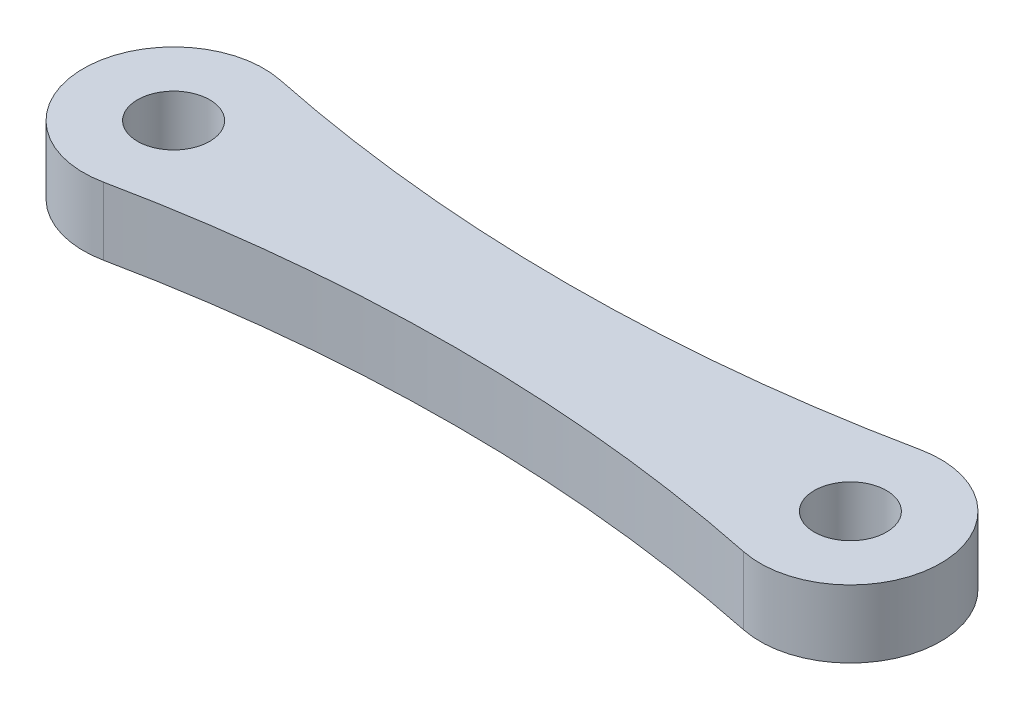
ISO-10303-21;
HEADER;
FILE_DESCRIPTION(('STEP AP214'),'2;1');
FILE_NAME('part.step','',(''),(''),'','','');
FILE_SCHEMA(('AUTOMOTIVE_DESIGN { 1 0 10303 214 1 1 1 1 }'));
ENDSEC;
DATA;
#1=APPLICATION_CONTEXT('core data for automotive mechanical design processes');
#2=APPLICATION_PROTOCOL_DEFINITION('international standard','automotive_design',2000,#1);
#3=PRODUCT_CONTEXT('',#1,'mechanical');
#4=PRODUCT('Part','Part','',(#3));
#5=PRODUCT_RELATED_PRODUCT_CATEGORY('part','',(#4));
#6=PRODUCT_DEFINITION_FORMATION('','',#4);
#7=PRODUCT_DEFINITION_CONTEXT('part definition',#1,'design');
#8=PRODUCT_DEFINITION('design','',#6,#7);
#9=PRODUCT_DEFINITION_SHAPE('','',#8);
#10=(LENGTH_UNIT() NAMED_UNIT(*) SI_UNIT(.MILLI.,.METRE.));
#11=(NAMED_UNIT(*) PLANE_ANGLE_UNIT() SI_UNIT($,.RADIAN.));
#12=(NAMED_UNIT(*) SI_UNIT($,.STERADIAN.) SOLID_ANGLE_UNIT());
#13=UNCERTAINTY_MEASURE_WITH_UNIT(LENGTH_MEASURE(1.E-05),#10,'distance_accuracy_value','');
#14=(GEOMETRIC_REPRESENTATION_CONTEXT(3) GLOBAL_UNCERTAINTY_ASSIGNED_CONTEXT((#13)) GLOBAL_UNIT_ASSIGNED_CONTEXT((#10,
#11,#12)) REPRESENTATION_CONTEXT('',''));
#15=CARTESIAN_POINT('',(0.,0.,0.));
#16=DIRECTION('',(0.,0.,1.));
#17=DIRECTION('',(1.,0.,0.));
#18=AXIS2_PLACEMENT_3D('',#15,#16,#17);
#19=CARTESIAN_POINT('',(-7.5,1.5,0.));
#20=DIRECTION('',(0.,1.,0.));
#21=DIRECTION('',(0.,0.,1.));
#22=AXIS2_PLACEMENT_3D('',#19,#20,#21);
#23=PLANE('',#22);
#24=CARTESIAN_POINT('',(-7.5,1.5,0.));
#25=DIRECTION('',(0.,1.,0.));
#26=DIRECTION('',(0.,0.,1.));
#27=AXIS2_PLACEMENT_3D('',#24,#25,#26);
#28=CIRCLE('',#27,0.800000000000001);
#29=CARTESIAN_POINT('',(-7.5,1.5,0.800000000000001));
#30=VERTEX_POINT('',#29);
#31=EDGE_CURVE('E87',#30,#30,#28,.T.);
#32=ORIENTED_EDGE('',*,*,#31,.F.);
#33=EDGE_LOOP('',(#32));
#34=FACE_BOUND('',#33,.T.);
#35=CARTESIAN_POINT('',(7.5,1.5,0.));
#36=DIRECTION('',(0.,1.,0.));
#37=DIRECTION('',(0.,0.,1.));
#38=AXIS2_PLACEMENT_3D('',#35,#36,#37);
#39=CIRCLE('',#38,0.800000000000001);
#40=CARTESIAN_POINT('',(7.5,1.5,0.799999999999998));
#41=VERTEX_POINT('',#40);
#42=EDGE_CURVE('E120',#41,#41,#39,.T.);
#43=ORIENTED_EDGE('',*,*,#42,.F.);
#44=EDGE_LOOP('',(#43));
#45=FACE_BOUND('',#44,.T.);
#46=CARTESIAN_POINT('',(7.5,1.5,0.));
#47=DIRECTION('',(0.,1.,0.));
#48=DIRECTION('',(0.,0.,1.));
#49=AXIS2_PLACEMENT_3D('',#46,#47,#48);
#50=CIRCLE('',#49,2.);
#51=CARTESIAN_POINT('',(7.09459459459459,1.5,1.95848065021539));
#52=VERTEX_POINT('',#51);
#53=CARTESIAN_POINT('',(7.09459459459459,1.5,-1.95848065021539));
#54=VERTEX_POINT('',#53);
#55=EDGE_CURVE('E12',#52,#54,#50,.T.);
#56=ORIENTED_EDGE('',*,*,#55,.T.);
#57=CARTESIAN_POINT('',(0.,1.5,-36.2318920289846));
#58=DIRECTION('',(0.,-1.,0.));
#59=DIRECTION('',(0.,0.,1.));
#60=AXIS2_PLACEMENT_3D('',#57,#58,#59);
#61=CIRCLE('',#60,35.);
#62=CARTESIAN_POINT('',(-7.09459459459459,1.5,-1.95848065021539));
#63=VERTEX_POINT('',#62);
#64=EDGE_CURVE('E106',#54,#63,#61,.T.);
#65=ORIENTED_EDGE('',*,*,#64,.T.);
#66=CARTESIAN_POINT('',(-7.5,1.5,0.));
#67=DIRECTION('',(0.,1.,0.));
#68=DIRECTION('',(0.,0.,1.));
#69=AXIS2_PLACEMENT_3D('',#66,#67,#68);
#70=CIRCLE('',#69,2.);
#71=CARTESIAN_POINT('',(-7.09459459459459,1.5,1.95848065021539));
#72=VERTEX_POINT('',#71);
#73=EDGE_CURVE('E50',#63,#72,#70,.T.);
#74=ORIENTED_EDGE('',*,*,#73,.T.);
#75=CARTESIAN_POINT('',(0.,1.5,36.2318920289846));
#76=DIRECTION('',(0.,-1.,0.));
#77=DIRECTION('',(0.,0.,-1.));
#78=AXIS2_PLACEMENT_3D('',#75,#76,#77);
#79=CIRCLE('',#78,35.);
#80=EDGE_CURVE('E100',#72,#52,#79,.T.);
#81=ORIENTED_EDGE('',*,*,#80,.T.);
#82=EDGE_LOOP('',(#56,#65,#74,#81));
#83=FACE_BOUND('',#82,.T.);
#84=ADVANCED_FACE('F40',(#34,#45,#83),#23,.T.);
#85=CARTESIAN_POINT('',(-7.5,0.,0.));
#86=DIRECTION('',(0.,1.,0.));
#87=DIRECTION('',(0.,0.,1.));
#88=AXIS2_PLACEMENT_3D('',#85,#86,#87);
#89=PLANE('',#88);
#90=CARTESIAN_POINT('',(-7.5,0.,0.));
#91=DIRECTION('',(0.,1.,0.));
#92=DIRECTION('',(0.,0.,1.));
#93=AXIS2_PLACEMENT_3D('',#90,#91,#92);
#94=CIRCLE('',#93,0.800000000000001);
#95=CARTESIAN_POINT('',(-7.5,0.,0.800000000000001));
#96=VERTEX_POINT('',#95);
#97=EDGE_CURVE('E124',#96,#96,#94,.T.);
#98=ORIENTED_EDGE('',*,*,#97,.T.);
#99=EDGE_LOOP('',(#98));
#100=FACE_BOUND('',#99,.T.);
#101=CARTESIAN_POINT('',(7.5,0.,0.));
#102=DIRECTION('',(0.,1.,0.));
#103=DIRECTION('',(0.,0.,1.));
#104=AXIS2_PLACEMENT_3D('',#101,#102,#103);
#105=CIRCLE('',#104,0.800000000000001);
#106=CARTESIAN_POINT('',(7.5,0.,0.799999999999998));
#107=VERTEX_POINT('',#106);
#108=EDGE_CURVE('E113',#107,#107,#105,.T.);
#109=ORIENTED_EDGE('',*,*,#108,.T.);
#110=EDGE_LOOP('',(#109));
#111=FACE_BOUND('',#110,.T.);
#112=CARTESIAN_POINT('',(0.,0.,-36.2318920289846));
#113=DIRECTION('',(0.,-1.,0.));
#114=DIRECTION('',(0.,0.,1.));
#115=AXIS2_PLACEMENT_3D('',#112,#113,#114);
#116=CIRCLE('',#115,35.);
#117=CARTESIAN_POINT('',(7.09459459459459,0.,-1.95848065021539));
#118=VERTEX_POINT('',#117);
#119=CARTESIAN_POINT('',(-7.09459459459459,0.,-1.95848065021539));
#120=VERTEX_POINT('',#119);
#121=EDGE_CURVE('E83',#118,#120,#116,.T.);
#122=ORIENTED_EDGE('',*,*,#121,.F.);
#123=CARTESIAN_POINT('',(7.5,0.,0.));
#124=DIRECTION('',(0.,1.,0.));
#125=DIRECTION('',(0.,0.,1.));
#126=AXIS2_PLACEMENT_3D('',#123,#124,#125);
#127=CIRCLE('',#126,2.);
#128=CARTESIAN_POINT('',(7.09459459459459,0.,1.95848065021539));
#129=VERTEX_POINT('',#128);
#130=EDGE_CURVE('E44',#129,#118,#127,.T.);
#131=ORIENTED_EDGE('',*,*,#130,.F.);
#132=CARTESIAN_POINT('',(0.,0.,36.2318920289846));
#133=DIRECTION('',(0.,-1.,0.));
#134=DIRECTION('',(0.,0.,-1.));
#135=AXIS2_PLACEMENT_3D('',#132,#133,#134);
#136=CIRCLE('',#135,35.);
#137=CARTESIAN_POINT('',(-7.09459459459459,0.,1.95848065021539));
#138=VERTEX_POINT('',#137);
#139=EDGE_CURVE('E85',#138,#129,#136,.T.);
#140=ORIENTED_EDGE('',*,*,#139,.F.);
#141=CARTESIAN_POINT('',(-7.5,0.,0.));
#142=DIRECTION('',(0.,1.,0.));
#143=DIRECTION('',(0.,0.,1.));
#144=AXIS2_PLACEMENT_3D('',#141,#142,#143);
#145=CIRCLE('',#144,2.);
#146=EDGE_CURVE('E58',#120,#138,#145,.T.);
#147=ORIENTED_EDGE('',*,*,#146,.F.);
#148=EDGE_LOOP('',(#122,#131,#140,#147));
#149=FACE_BOUND('',#148,.T.);
#150=ADVANCED_FACE('F81',(#100,#111,#149),#89,.F.);
#151=CARTESIAN_POINT('',(-7.5,1.5,0.));
#152=DIRECTION('',(0.,-1.,0.));
#153=DIRECTION('',(0.,0.,-1.));
#154=AXIS2_PLACEMENT_3D('',#151,#152,#153);
#155=CYLINDRICAL_SURFACE('',#154,2.);
#156=ORIENTED_EDGE('',*,*,#146,.T.);
#157=DIRECTION('',(0.,1.,0.));
#158=VECTOR('',#157,1.);
#159=CARTESIAN_POINT('',(-7.09459459459459,0.,1.95848065021539));
#160=LINE('',#159,#158);
#161=EDGE_CURVE('E93',#138,#72,#160,.T.);
#162=ORIENTED_EDGE('',*,*,#161,.T.);
#163=ORIENTED_EDGE('',*,*,#73,.F.);
#164=DIRECTION('',(0.,1.,0.));
#165=VECTOR('',#164,1.);
#166=CARTESIAN_POINT('',(-7.09459459459459,0.,-1.95848065021539));
#167=LINE('',#166,#165);
#168=EDGE_CURVE('E88',#120,#63,#167,.T.);
#169=ORIENTED_EDGE('',*,*,#168,.F.);
#170=EDGE_LOOP('',(#156,#162,#163,#169));
#171=FACE_BOUND('',#170,.T.);
#172=ADVANCED_FACE('F42',(#171),#155,.T.);
#173=CARTESIAN_POINT('',(7.5,1.5,0.));
#174=DIRECTION('',(0.,-1.,0.));
#175=DIRECTION('',(0.,0.,-1.));
#176=AXIS2_PLACEMENT_3D('',#173,#174,#175);
#177=CYLINDRICAL_SURFACE('',#176,2.);
#178=ORIENTED_EDGE('',*,*,#130,.T.);
#179=DIRECTION('',(0.,1.,0.));
#180=VECTOR('',#179,1.);
#181=CARTESIAN_POINT('',(7.09459459459459,0.,-1.95848065021539));
#182=LINE('',#181,#180);
#183=EDGE_CURVE('E98',#118,#54,#182,.T.);
#184=ORIENTED_EDGE('',*,*,#183,.T.);
#185=ORIENTED_EDGE('',*,*,#55,.F.);
#186=DIRECTION('',(0.,1.,0.));
#187=VECTOR('',#186,1.);
#188=CARTESIAN_POINT('',(7.09459459459459,0.,1.95848065021539));
#189=LINE('',#188,#187);
#190=EDGE_CURVE('E114',#129,#52,#189,.T.);
#191=ORIENTED_EDGE('',*,*,#190,.F.);
#192=EDGE_LOOP('',(#178,#184,#185,#191));
#193=FACE_BOUND('',#192,.T.);
#194=ADVANCED_FACE('F139',(#193),#177,.T.);
#195=CARTESIAN_POINT('',(-7.5,1.5,0.));
#196=DIRECTION('',(0.,-1.,0.));
#197=DIRECTION('',(0.,0.,-1.));
#198=AXIS2_PLACEMENT_3D('',#195,#196,#197);
#199=CYLINDRICAL_SURFACE('',#198,0.800000000000001);
#200=ORIENTED_EDGE('',*,*,#31,.T.);
#201=EDGE_LOOP('',(#200));
#202=FACE_BOUND('',#201,.T.);
#203=ORIENTED_EDGE('',*,*,#97,.F.);
#204=EDGE_LOOP('',(#203));
#205=FACE_BOUND('',#204,.T.);
#206=ADVANCED_FACE('F154',(#202,#205),#199,.F.);
#207=CARTESIAN_POINT('',(7.5,1.5,0.));
#208=DIRECTION('',(0.,-1.,0.));
#209=DIRECTION('',(0.,0.,-1.));
#210=AXIS2_PLACEMENT_3D('',#207,#208,#209);
#211=CYLINDRICAL_SURFACE('',#210,0.800000000000001);
#212=ORIENTED_EDGE('',*,*,#42,.T.);
#213=EDGE_LOOP('',(#212));
#214=FACE_BOUND('',#213,.T.);
#215=ORIENTED_EDGE('',*,*,#108,.F.);
#216=EDGE_LOOP('',(#215));
#217=FACE_BOUND('',#216,.T.);
#218=ADVANCED_FACE('F161',(#214,#217),#211,.F.);
#219=CARTESIAN_POINT('',(0.,0.,-36.2318920289846));
#220=DIRECTION('',(0.,1.,0.));
#221=DIRECTION('',(0.,0.,1.));
#222=AXIS2_PLACEMENT_3D('',#219,#220,#221);
#223=CYLINDRICAL_SURFACE('',#222,35.);
#224=ORIENTED_EDGE('',*,*,#64,.F.);
#225=ORIENTED_EDGE('',*,*,#183,.F.);
#226=ORIENTED_EDGE('',*,*,#121,.T.);
#227=ORIENTED_EDGE('',*,*,#168,.T.);
#228=EDGE_LOOP('',(#224,#225,#226,#227));
#229=FACE_BOUND('',#228,.T.);
#230=ADVANCED_FACE('F96',(#229),#223,.F.);
#231=CARTESIAN_POINT('',(0.,0.,36.2318920289846));
#232=DIRECTION('',(0.,1.,0.));
#233=DIRECTION('',(0.,0.,1.));
#234=AXIS2_PLACEMENT_3D('',#231,#232,#233);
#235=CYLINDRICAL_SURFACE('',#234,35.);
#236=ORIENTED_EDGE('',*,*,#80,.F.);
#237=ORIENTED_EDGE('',*,*,#161,.F.);
#238=ORIENTED_EDGE('',*,*,#139,.T.);
#239=ORIENTED_EDGE('',*,*,#190,.T.);
#240=EDGE_LOOP('',(#236,#237,#238,#239));
#241=FACE_BOUND('',#240,.T.);
#242=ADVANCED_FACE('F142',(#241),#235,.F.);
#243=CLOSED_SHELL('',(#84,#150,#172,#194,#206,#218,#230,#242));
#244=MANIFOLD_SOLID_BREP('B2',#243);
#245=ADVANCED_BREP_SHAPE_REPRESENTATION('',(#18,#244),#14);
#246=SHAPE_DEFINITION_REPRESENTATION(#9,#245);
ENDSEC;
END-ISO-10303-21;
